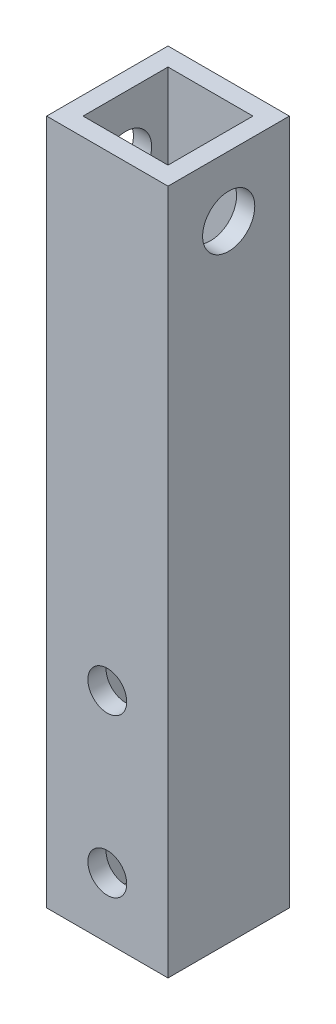
ISO-10303-21;
HEADER;
FILE_DESCRIPTION(('STEP AP214'),'2;1');
FILE_NAME('part.step','',(''),(''),'','','');
FILE_SCHEMA(('AUTOMOTIVE_DESIGN { 1 0 10303 214 1 1 1 1 }'));
ENDSEC;
DATA;
#1=APPLICATION_CONTEXT('core data for automotive mechanical design processes');
#2=APPLICATION_PROTOCOL_DEFINITION('international standard','automotive_design',2000,#1);
#3=PRODUCT_CONTEXT('',#1,'mechanical');
#4=PRODUCT('Part','Part','',(#3));
#5=PRODUCT_RELATED_PRODUCT_CATEGORY('part','',(#4));
#6=PRODUCT_DEFINITION_FORMATION('','',#4);
#7=PRODUCT_DEFINITION_CONTEXT('part definition',#1,'design');
#8=PRODUCT_DEFINITION('design','',#6,#7);
#9=PRODUCT_DEFINITION_SHAPE('','',#8);
#10=(LENGTH_UNIT() NAMED_UNIT(*) SI_UNIT(.MILLI.,.METRE.));
#11=(NAMED_UNIT(*) PLANE_ANGLE_UNIT() SI_UNIT($,.RADIAN.));
#12=(NAMED_UNIT(*) SI_UNIT($,.STERADIAN.) SOLID_ANGLE_UNIT());
#13=UNCERTAINTY_MEASURE_WITH_UNIT(LENGTH_MEASURE(1.E-05),#10,'distance_accuracy_value','');
#14=(GEOMETRIC_REPRESENTATION_CONTEXT(3) GLOBAL_UNCERTAINTY_ASSIGNED_CONTEXT((#13)) GLOBAL_UNIT_ASSIGNED_CONTEXT((#10,
#11,#12)) REPRESENTATION_CONTEXT('',''));
#15=CARTESIAN_POINT('',(0.,0.,0.));
#16=DIRECTION('',(0.,0.,1.));
#17=DIRECTION('',(1.,0.,0.));
#18=AXIS2_PLACEMENT_3D('',#15,#16,#17);
#19=CARTESIAN_POINT('',(0.,56.5,0.));
#20=DIRECTION('',(0.,1.,0.));
#21=DIRECTION('',(0.,0.,1.));
#22=AXIS2_PLACEMENT_3D('',#19,#20,#21);
#23=PLANE('',#22);
#24=DIRECTION('',(0.,0.,-1.));
#25=VECTOR('',#24,1.);
#26=CARTESIAN_POINT('',(5.,56.5,-5.));
#27=LINE('',#26,#25);
#28=CARTESIAN_POINT('',(5.,56.5,5.));
#29=VERTEX_POINT('',#28);
#30=CARTESIAN_POINT('',(5.,56.5,-5.));
#31=VERTEX_POINT('',#30);
#32=EDGE_CURVE('E162',#29,#31,#27,.T.);
#33=ORIENTED_EDGE('',*,*,#32,.T.);
#34=DIRECTION('',(-1.,0.,0.));
#35=VECTOR('',#34,1.);
#36=CARTESIAN_POINT('',(-5.,56.5,-5.));
#37=LINE('',#36,#35);
#38=CARTESIAN_POINT('',(-5.,56.5,-5.));
#39=VERTEX_POINT('',#38);
#40=EDGE_CURVE('E165',#31,#39,#37,.T.);
#41=ORIENTED_EDGE('',*,*,#40,.T.);
#42=DIRECTION('',(0.,0.,1.));
#43=VECTOR('',#42,1.);
#44=CARTESIAN_POINT('',(-5.,56.5,-5.));
#45=LINE('',#44,#43);
#46=CARTESIAN_POINT('',(-5.,56.5,5.));
#47=VERTEX_POINT('',#46);
#48=EDGE_CURVE('E168',#39,#47,#45,.T.);
#49=ORIENTED_EDGE('',*,*,#48,.T.);
#50=DIRECTION('',(1.,0.,0.));
#51=VECTOR('',#50,1.);
#52=CARTESIAN_POINT('',(-5.,56.5,5.));
#53=LINE('',#52,#51);
#54=EDGE_CURVE('E170',#47,#29,#53,.T.);
#55=ORIENTED_EDGE('',*,*,#54,.T.);
#56=EDGE_LOOP('',(#33,#41,#49,#55));
#57=FACE_BOUND('',#56,.T.);
#58=DIRECTION('',(-1.,0.,0.));
#59=VECTOR('',#58,1.);
#60=CARTESIAN_POINT('',(-5.,56.5,-3.5));
#61=LINE('',#60,#59);
#62=CARTESIAN_POINT('',(3.5,56.5,-3.5));
#63=VERTEX_POINT('',#62);
#64=CARTESIAN_POINT('',(-3.5,56.5,-3.5));
#65=VERTEX_POINT('',#64);
#66=EDGE_CURVE('E132',#63,#65,#61,.T.);
#67=ORIENTED_EDGE('',*,*,#66,.F.);
#68=DIRECTION('',(0.,0.,-1.));
#69=VECTOR('',#68,1.);
#70=CARTESIAN_POINT('',(3.5,56.5,-5.));
#71=LINE('',#70,#69);
#72=CARTESIAN_POINT('',(3.5,56.5,3.5));
#73=VERTEX_POINT('',#72);
#74=EDGE_CURVE('E124',#73,#63,#71,.T.);
#75=ORIENTED_EDGE('',*,*,#74,.F.);
#76=DIRECTION('',(1.,0.,0.));
#77=VECTOR('',#76,1.);
#78=CARTESIAN_POINT('',(-5.,56.5,3.5));
#79=LINE('',#78,#77);
#80=CARTESIAN_POINT('',(-3.5,56.5,3.5));
#81=VERTEX_POINT('',#80);
#82=EDGE_CURVE('E146',#81,#73,#79,.T.);
#83=ORIENTED_EDGE('',*,*,#82,.F.);
#84=DIRECTION('',(0.,0.,1.));
#85=VECTOR('',#84,1.);
#86=CARTESIAN_POINT('',(-3.5,56.5,-5.));
#87=LINE('',#86,#85);
#88=EDGE_CURVE('E144',#65,#81,#87,.T.);
#89=ORIENTED_EDGE('',*,*,#88,.F.);
#90=EDGE_LOOP('',(#67,#75,#83,#89));
#91=FACE_BOUND('',#90,.T.);
#92=ADVANCED_FACE('F57',(#57,#91),#23,.T.);
#93=CARTESIAN_POINT('',(0.,0.,0.));
#94=DIRECTION('',(0.,1.,0.));
#95=DIRECTION('',(0.,0.,1.));
#96=AXIS2_PLACEMENT_3D('',#93,#94,#95);
#97=PLANE('',#96);
#98=DIRECTION('',(0.,0.,-1.));
#99=VECTOR('',#98,1.);
#100=CARTESIAN_POINT('',(5.,0.,-5.));
#101=LINE('',#100,#99);
#102=CARTESIAN_POINT('',(5.,0.,5.));
#103=VERTEX_POINT('',#102);
#104=CARTESIAN_POINT('',(5.,0.,-5.));
#105=VERTEX_POINT('',#104);
#106=EDGE_CURVE('E140',#103,#105,#101,.T.);
#107=ORIENTED_EDGE('',*,*,#106,.F.);
#108=DIRECTION('',(1.,0.,0.));
#109=VECTOR('',#108,1.);
#110=CARTESIAN_POINT('',(-5.,0.,5.));
#111=LINE('',#110,#109);
#112=CARTESIAN_POINT('',(-5.,0.,5.));
#113=VERTEX_POINT('',#112);
#114=EDGE_CURVE('E166',#113,#103,#111,.T.);
#115=ORIENTED_EDGE('',*,*,#114,.F.);
#116=DIRECTION('',(0.,0.,1.));
#117=VECTOR('',#116,1.);
#118=CARTESIAN_POINT('',(-5.,0.,-5.));
#119=LINE('',#118,#117);
#120=CARTESIAN_POINT('',(-5.,0.,-5.));
#121=VERTEX_POINT('',#120);
#122=EDGE_CURVE('E177',#121,#113,#119,.T.);
#123=ORIENTED_EDGE('',*,*,#122,.F.);
#124=DIRECTION('',(-1.,0.,0.));
#125=VECTOR('',#124,1.);
#126=CARTESIAN_POINT('',(-5.,0.,-5.));
#127=LINE('',#126,#125);
#128=EDGE_CURVE('E175',#105,#121,#127,.T.);
#129=ORIENTED_EDGE('',*,*,#128,.F.);
#130=EDGE_LOOP('',(#107,#115,#123,#129));
#131=FACE_BOUND('',#130,.T.);
#132=DIRECTION('',(0.,0.,-1.));
#133=VECTOR('',#132,1.);
#134=CARTESIAN_POINT('',(3.5,0.,-5.));
#135=LINE('',#134,#133);
#136=CARTESIAN_POINT('',(3.5,0.,3.5));
#137=VERTEX_POINT('',#136);
#138=CARTESIAN_POINT('',(3.5,0.,-3.5));
#139=VERTEX_POINT('',#138);
#140=EDGE_CURVE('E82',#137,#139,#135,.T.);
#141=ORIENTED_EDGE('',*,*,#140,.T.);
#142=DIRECTION('',(-1.,0.,0.));
#143=VECTOR('',#142,1.);
#144=CARTESIAN_POINT('',(-5.,0.,-3.5));
#145=LINE('',#144,#143);
#146=CARTESIAN_POINT('',(-3.5,0.,-3.5));
#147=VERTEX_POINT('',#146);
#148=EDGE_CURVE('E139',#139,#147,#145,.T.);
#149=ORIENTED_EDGE('',*,*,#148,.T.);
#150=DIRECTION('',(0.,0.,1.));
#151=VECTOR('',#150,1.);
#152=CARTESIAN_POINT('',(-3.5,0.,-5.));
#153=LINE('',#152,#151);
#154=CARTESIAN_POINT('',(-3.5,0.,3.5));
#155=VERTEX_POINT('',#154);
#156=EDGE_CURVE('E154',#147,#155,#153,.T.);
#157=ORIENTED_EDGE('',*,*,#156,.T.);
#158=DIRECTION('',(1.,0.,0.));
#159=VECTOR('',#158,1.);
#160=CARTESIAN_POINT('',(-5.,0.,3.5));
#161=LINE('',#160,#159);
#162=EDGE_CURVE('E133',#155,#137,#161,.T.);
#163=ORIENTED_EDGE('',*,*,#162,.T.);
#164=EDGE_LOOP('',(#141,#149,#157,#163));
#165=FACE_BOUND('',#164,.T.);
#166=ADVANCED_FACE('F235',(#131,#165),#97,.F.);
#167=CARTESIAN_POINT('',(5.,56.5,-5.));
#168=DIRECTION('',(-1.,0.,0.));
#169=DIRECTION('',(0.,0.,1.));
#170=AXIS2_PLACEMENT_3D('',#167,#168,#169);
#171=PLANE('',#170);
#172=CARTESIAN_POINT('',(5.,51.5,0.));
#173=DIRECTION('',(1.,0.,0.));
#174=DIRECTION('',(0.,0.,-1.));
#175=AXIS2_PLACEMENT_3D('',#172,#173,#174);
#176=CIRCLE('',#175,2.15);
#177=CARTESIAN_POINT('',(5.,51.5,-2.15));
#178=VERTEX_POINT('',#177);
#179=EDGE_CURVE('E215',#178,#178,#176,.T.);
#180=ORIENTED_EDGE('',*,*,#179,.F.);
#181=EDGE_LOOP('',(#180));
#182=FACE_BOUND('',#181,.T.);
#183=ORIENTED_EDGE('',*,*,#106,.T.);
#184=DIRECTION('',(0.,-1.,0.));
#185=VECTOR('',#184,1.);
#186=CARTESIAN_POINT('',(5.,56.5,-5.));
#187=LINE('',#186,#185);
#188=EDGE_CURVE('E12',#31,#105,#187,.T.);
#189=ORIENTED_EDGE('',*,*,#188,.F.);
#190=ORIENTED_EDGE('',*,*,#32,.F.);
#191=DIRECTION('',(0.,-1.,0.));
#192=VECTOR('',#191,1.);
#193=CARTESIAN_POINT('',(5.,56.5,5.));
#194=LINE('',#193,#192);
#195=EDGE_CURVE('E172',#29,#103,#194,.T.);
#196=ORIENTED_EDGE('',*,*,#195,.T.);
#197=EDGE_LOOP('',(#183,#189,#190,#196));
#198=FACE_BOUND('',#197,.T.);
#199=ADVANCED_FACE('F59',(#182,#198),#171,.F.);
#200=CARTESIAN_POINT('',(-5.,56.5,-5.));
#201=DIRECTION('',(0.,0.,1.));
#202=DIRECTION('',(1.,0.,0.));
#203=AXIS2_PLACEMENT_3D('',#200,#201,#202);
#204=PLANE('',#203);
#205=CARTESIAN_POINT('',(0.,18.,-5.));
#206=DIRECTION('',(0.,0.,1.));
#207=DIRECTION('',(1.,0.,0.));
#208=AXIS2_PLACEMENT_3D('',#205,#206,#207);
#209=CIRCLE('',#208,1.6);
#210=CARTESIAN_POINT('',(1.6,18.,-5.));
#211=VERTEX_POINT('',#210);
#212=EDGE_CURVE('E190',#211,#211,#209,.T.);
#213=ORIENTED_EDGE('',*,*,#212,.T.);
#214=EDGE_LOOP('',(#213));
#215=FACE_BOUND('',#214,.T.);
#216=CARTESIAN_POINT('',(0.,5.,-5.));
#217=DIRECTION('',(0.,0.,1.));
#218=DIRECTION('',(1.,0.,0.));
#219=AXIS2_PLACEMENT_3D('',#216,#217,#218);
#220=CIRCLE('',#219,1.6);
#221=CARTESIAN_POINT('',(1.6,5.,-5.));
#222=VERTEX_POINT('',#221);
#223=EDGE_CURVE('E204',#222,#222,#220,.T.);
#224=ORIENTED_EDGE('',*,*,#223,.T.);
#225=EDGE_LOOP('',(#224));
#226=FACE_BOUND('',#225,.T.);
#227=ORIENTED_EDGE('',*,*,#128,.T.);
#228=DIRECTION('',(0.,-1.,0.));
#229=VECTOR('',#228,1.);
#230=CARTESIAN_POINT('',(-5.,56.5,-5.));
#231=LINE('',#230,#229);
#232=EDGE_CURVE('E66',#39,#121,#231,.T.);
#233=ORIENTED_EDGE('',*,*,#232,.F.);
#234=ORIENTED_EDGE('',*,*,#40,.F.);
#235=ORIENTED_EDGE('',*,*,#188,.T.);
#236=EDGE_LOOP('',(#227,#233,#234,#235));
#237=FACE_BOUND('',#236,.T.);
#238=ADVANCED_FACE('F265',(#215,#226,#237),#204,.F.);
#239=CARTESIAN_POINT('',(-5.,56.5,-5.));
#240=DIRECTION('',(1.,0.,0.));
#241=DIRECTION('',(0.,0.,-1.));
#242=AXIS2_PLACEMENT_3D('',#239,#240,#241);
#243=PLANE('',#242);
#244=CARTESIAN_POINT('',(-5.,51.5,0.));
#245=DIRECTION('',(1.,0.,0.));
#246=DIRECTION('',(0.,0.,-1.));
#247=AXIS2_PLACEMENT_3D('',#244,#245,#246);
#248=CIRCLE('',#247,2.15);
#249=CARTESIAN_POINT('',(-5.,51.5,-2.15));
#250=VERTEX_POINT('',#249);
#251=EDGE_CURVE('E218',#250,#250,#248,.T.);
#252=ORIENTED_EDGE('',*,*,#251,.T.);
#253=EDGE_LOOP('',(#252));
#254=FACE_BOUND('',#253,.T.);
#255=ORIENTED_EDGE('',*,*,#122,.T.);
#256=DIRECTION('',(0.,-1.,0.));
#257=VECTOR('',#256,1.);
#258=CARTESIAN_POINT('',(-5.,56.5,5.));
#259=LINE('',#258,#257);
#260=EDGE_CURVE('E182',#47,#113,#259,.T.);
#261=ORIENTED_EDGE('',*,*,#260,.F.);
#262=ORIENTED_EDGE('',*,*,#48,.F.);
#263=ORIENTED_EDGE('',*,*,#232,.T.);
#264=EDGE_LOOP('',(#255,#261,#262,#263));
#265=FACE_BOUND('',#264,.T.);
#266=ADVANCED_FACE('F262',(#254,#265),#243,.F.);
#267=CARTESIAN_POINT('',(-5.,56.5,5.));
#268=DIRECTION('',(0.,0.,-1.));
#269=DIRECTION('',(-1.,0.,0.));
#270=AXIS2_PLACEMENT_3D('',#267,#268,#269);
#271=PLANE('',#270);
#272=CARTESIAN_POINT('',(0.,18.,5.));
#273=DIRECTION('',(0.,0.,1.));
#274=DIRECTION('',(1.,0.,0.));
#275=AXIS2_PLACEMENT_3D('',#272,#273,#274);
#276=CIRCLE('',#275,1.6);
#277=CARTESIAN_POINT('',(1.6,18.,5.));
#278=VERTEX_POINT('',#277);
#279=EDGE_CURVE('E208',#278,#278,#276,.T.);
#280=ORIENTED_EDGE('',*,*,#279,.F.);
#281=EDGE_LOOP('',(#280));
#282=FACE_BOUND('',#281,.T.);
#283=CARTESIAN_POINT('',(0.,5.,5.));
#284=DIRECTION('',(0.,0.,1.));
#285=DIRECTION('',(1.,0.,0.));
#286=AXIS2_PLACEMENT_3D('',#283,#284,#285);
#287=CIRCLE('',#286,1.6);
#288=CARTESIAN_POINT('',(1.6,5.,5.));
#289=VERTEX_POINT('',#288);
#290=EDGE_CURVE('E201',#289,#289,#287,.T.);
#291=ORIENTED_EDGE('',*,*,#290,.F.);
#292=EDGE_LOOP('',(#291));
#293=FACE_BOUND('',#292,.T.);
#294=ORIENTED_EDGE('',*,*,#114,.T.);
#295=ORIENTED_EDGE('',*,*,#195,.F.);
#296=ORIENTED_EDGE('',*,*,#54,.F.);
#297=ORIENTED_EDGE('',*,*,#260,.T.);
#298=EDGE_LOOP('',(#294,#295,#296,#297));
#299=FACE_BOUND('',#298,.T.);
#300=ADVANCED_FACE('F259',(#282,#293,#299),#271,.F.);
#301=CARTESIAN_POINT('',(3.5,56.5,-5.));
#302=DIRECTION('',(-1.,0.,0.));
#303=DIRECTION('',(0.,0.,1.));
#304=AXIS2_PLACEMENT_3D('',#301,#302,#303);
#305=PLANE('',#304);
#306=CARTESIAN_POINT('',(3.5,51.5,0.));
#307=DIRECTION('',(-1.,0.,0.));
#308=DIRECTION('',(0.,0.,1.));
#309=AXIS2_PLACEMENT_3D('',#306,#307,#308);
#310=CIRCLE('',#309,2.15);
#311=CARTESIAN_POINT('',(3.5,51.5,2.15));
#312=VERTEX_POINT('',#311);
#313=EDGE_CURVE('E205',#312,#312,#310,.T.);
#314=ORIENTED_EDGE('',*,*,#313,.F.);
#315=EDGE_LOOP('',(#314));
#316=FACE_BOUND('',#315,.T.);
#317=ORIENTED_EDGE('',*,*,#140,.F.);
#318=DIRECTION('',(0.,-1.,0.));
#319=VECTOR('',#318,1.);
#320=CARTESIAN_POINT('',(3.5,56.5,3.5));
#321=LINE('',#320,#319);
#322=EDGE_CURVE('E128',#73,#137,#321,.T.);
#323=ORIENTED_EDGE('',*,*,#322,.F.);
#324=ORIENTED_EDGE('',*,*,#74,.T.);
#325=DIRECTION('',(0.,-1.,0.));
#326=VECTOR('',#325,1.);
#327=CARTESIAN_POINT('',(3.5,56.5,-3.5));
#328=LINE('',#327,#326);
#329=EDGE_CURVE('E127',#63,#139,#328,.T.);
#330=ORIENTED_EDGE('',*,*,#329,.T.);
#331=EDGE_LOOP('',(#317,#323,#324,#330));
#332=FACE_BOUND('',#331,.T.);
#333=ADVANCED_FACE('F126',(#316,#332),#305,.T.);
#334=CARTESIAN_POINT('',(-5.,56.5,-3.5));
#335=DIRECTION('',(0.,0.,1.));
#336=DIRECTION('',(1.,0.,0.));
#337=AXIS2_PLACEMENT_3D('',#334,#335,#336);
#338=PLANE('',#337);
#339=CARTESIAN_POINT('',(0.,18.,-3.5));
#340=DIRECTION('',(0.,0.,1.));
#341=DIRECTION('',(1.,0.,0.));
#342=AXIS2_PLACEMENT_3D('',#339,#340,#341);
#343=CIRCLE('',#342,1.6);
#344=CARTESIAN_POINT('',(1.6,18.,-3.5));
#345=VERTEX_POINT('',#344);
#346=EDGE_CURVE('E152',#345,#345,#343,.T.);
#347=ORIENTED_EDGE('',*,*,#346,.F.);
#348=EDGE_LOOP('',(#347));
#349=FACE_BOUND('',#348,.T.);
#350=CARTESIAN_POINT('',(0.,5.,-3.5));
#351=DIRECTION('',(0.,0.,1.));
#352=DIRECTION('',(1.,0.,0.));
#353=AXIS2_PLACEMENT_3D('',#350,#351,#352);
#354=CIRCLE('',#353,1.6);
#355=CARTESIAN_POINT('',(1.6,5.,-3.5));
#356=VERTEX_POINT('',#355);
#357=EDGE_CURVE('E189',#356,#356,#354,.T.);
#358=ORIENTED_EDGE('',*,*,#357,.F.);
#359=EDGE_LOOP('',(#358));
#360=FACE_BOUND('',#359,.T.);
#361=ORIENTED_EDGE('',*,*,#148,.F.);
#362=ORIENTED_EDGE('',*,*,#329,.F.);
#363=ORIENTED_EDGE('',*,*,#66,.T.);
#364=DIRECTION('',(0.,-1.,0.));
#365=VECTOR('',#364,1.);
#366=CARTESIAN_POINT('',(-3.5,56.5,-3.5));
#367=LINE('',#366,#365);
#368=EDGE_CURVE('E141',#65,#147,#367,.T.);
#369=ORIENTED_EDGE('',*,*,#368,.T.);
#370=EDGE_LOOP('',(#361,#362,#363,#369));
#371=FACE_BOUND('',#370,.T.);
#372=ADVANCED_FACE('F136',(#349,#360,#371),#338,.T.);
#373=CARTESIAN_POINT('',(-3.5,56.5,-5.));
#374=DIRECTION('',(1.,0.,0.));
#375=DIRECTION('',(0.,0.,-1.));
#376=AXIS2_PLACEMENT_3D('',#373,#374,#375);
#377=PLANE('',#376);
#378=CARTESIAN_POINT('',(-3.5,51.5,0.));
#379=DIRECTION('',(1.,0.,0.));
#380=DIRECTION('',(0.,0.,-1.));
#381=AXIS2_PLACEMENT_3D('',#378,#379,#380);
#382=CIRCLE('',#381,2.15);
#383=CARTESIAN_POINT('',(-3.5,51.5,-2.15));
#384=VERTEX_POINT('',#383);
#385=EDGE_CURVE('E61',#384,#384,#382,.T.);
#386=ORIENTED_EDGE('',*,*,#385,.F.);
#387=EDGE_LOOP('',(#386));
#388=FACE_BOUND('',#387,.T.);
#389=ORIENTED_EDGE('',*,*,#156,.F.);
#390=ORIENTED_EDGE('',*,*,#368,.F.);
#391=ORIENTED_EDGE('',*,*,#88,.T.);
#392=DIRECTION('',(0.,-1.,0.));
#393=VECTOR('',#392,1.);
#394=CARTESIAN_POINT('',(-3.5,56.5,3.5));
#395=LINE('',#394,#393);
#396=EDGE_CURVE('E74',#81,#155,#395,.T.);
#397=ORIENTED_EDGE('',*,*,#396,.T.);
#398=EDGE_LOOP('',(#389,#390,#391,#397));
#399=FACE_BOUND('',#398,.T.);
#400=ADVANCED_FACE('F228',(#388,#399),#377,.T.);
#401=CARTESIAN_POINT('',(-5.,56.5,3.5));
#402=DIRECTION('',(0.,0.,-1.));
#403=DIRECTION('',(-1.,0.,0.));
#404=AXIS2_PLACEMENT_3D('',#401,#402,#403);
#405=PLANE('',#404);
#406=CARTESIAN_POINT('',(0.,18.,3.5));
#407=DIRECTION('',(0.,0.,-1.));
#408=DIRECTION('',(-1.,0.,0.));
#409=AXIS2_PLACEMENT_3D('',#406,#407,#408);
#410=CIRCLE('',#409,1.6);
#411=CARTESIAN_POINT('',(-1.6,18.,3.5));
#412=VERTEX_POINT('',#411);
#413=EDGE_CURVE('E191',#412,#412,#410,.T.);
#414=ORIENTED_EDGE('',*,*,#413,.F.);
#415=EDGE_LOOP('',(#414));
#416=FACE_BOUND('',#415,.T.);
#417=CARTESIAN_POINT('',(0.,5.,3.5));
#418=DIRECTION('',(0.,0.,-1.));
#419=DIRECTION('',(-1.,0.,0.));
#420=AXIS2_PLACEMENT_3D('',#417,#418,#419);
#421=CIRCLE('',#420,1.6);
#422=CARTESIAN_POINT('',(-1.6,5.,3.5));
#423=VERTEX_POINT('',#422);
#424=EDGE_CURVE('E187',#423,#423,#421,.T.);
#425=ORIENTED_EDGE('',*,*,#424,.F.);
#426=EDGE_LOOP('',(#425));
#427=FACE_BOUND('',#426,.T.);
#428=ORIENTED_EDGE('',*,*,#162,.F.);
#429=ORIENTED_EDGE('',*,*,#396,.F.);
#430=ORIENTED_EDGE('',*,*,#82,.T.);
#431=ORIENTED_EDGE('',*,*,#322,.T.);
#432=EDGE_LOOP('',(#428,#429,#430,#431));
#433=FACE_BOUND('',#432,.T.);
#434=ADVANCED_FACE('F231',(#416,#427,#433),#405,.T.);
#435=CARTESIAN_POINT('',(0.,5.,-5.));
#436=DIRECTION('',(0.,0.,1.));
#437=DIRECTION('',(1.,0.,0.));
#438=AXIS2_PLACEMENT_3D('',#435,#436,#437);
#439=CYLINDRICAL_SURFACE('',#438,1.6);
#440=ORIENTED_EDGE('',*,*,#424,.T.);
#441=EDGE_LOOP('',(#440));
#442=FACE_BOUND('',#441,.T.);
#443=ORIENTED_EDGE('',*,*,#290,.T.);
#444=EDGE_LOOP('',(#443));
#445=FACE_BOUND('',#444,.T.);
#446=ADVANCED_FACE('F237',(#442,#445),#439,.F.);
#447=CARTESIAN_POINT('',(0.,18.,-5.));
#448=DIRECTION('',(0.,0.,1.));
#449=DIRECTION('',(1.,0.,0.));
#450=AXIS2_PLACEMENT_3D('',#447,#448,#449);
#451=CYLINDRICAL_SURFACE('',#450,1.6);
#452=ORIENTED_EDGE('',*,*,#413,.T.);
#453=EDGE_LOOP('',(#452));
#454=FACE_BOUND('',#453,.T.);
#455=ORIENTED_EDGE('',*,*,#279,.T.);
#456=EDGE_LOOP('',(#455));
#457=FACE_BOUND('',#456,.T.);
#458=ADVANCED_FACE('F243',(#454,#457),#451,.F.);
#459=ORIENTED_EDGE('',*,*,#357,.T.);
#460=EDGE_LOOP('',(#459));
#461=FACE_BOUND('',#460,.T.);
#462=ORIENTED_EDGE('',*,*,#223,.F.);
#463=EDGE_LOOP('',(#462));
#464=FACE_BOUND('',#463,.T.);
#465=ADVANCED_FACE('F246',(#461,#464),#439,.F.);
#466=ORIENTED_EDGE('',*,*,#346,.T.);
#467=EDGE_LOOP('',(#466));
#468=FACE_BOUND('',#467,.T.);
#469=ORIENTED_EDGE('',*,*,#212,.F.);
#470=EDGE_LOOP('',(#469));
#471=FACE_BOUND('',#470,.T.);
#472=ADVANCED_FACE('F291',(#468,#471),#451,.F.);
#473=CARTESIAN_POINT('',(-5.,51.5,0.));
#474=DIRECTION('',(1.,0.,0.));
#475=DIRECTION('',(0.,0.,-1.));
#476=AXIS2_PLACEMENT_3D('',#473,#474,#475);
#477=CYLINDRICAL_SURFACE('',#476,2.15);
#478=ORIENTED_EDGE('',*,*,#385,.T.);
#479=EDGE_LOOP('',(#478));
#480=FACE_BOUND('',#479,.T.);
#481=ORIENTED_EDGE('',*,*,#251,.F.);
#482=EDGE_LOOP('',(#481));
#483=FACE_BOUND('',#482,.T.);
#484=ADVANCED_FACE('F225',(#480,#483),#477,.F.);
#485=ORIENTED_EDGE('',*,*,#313,.T.);
#486=EDGE_LOOP('',(#485));
#487=FACE_BOUND('',#486,.T.);
#488=ORIENTED_EDGE('',*,*,#179,.T.);
#489=EDGE_LOOP('',(#488));
#490=FACE_BOUND('',#489,.T.);
#491=ADVANCED_FACE('F300',(#487,#490),#477,.F.);
#492=CLOSED_SHELL('',(#92,#166,#199,#238,#266,#300,#333,#372,#400,#434,#446,#458,#465,#472,#484,#491));
#493=MANIFOLD_SOLID_BREP('B2',#492);
#494=ADVANCED_BREP_SHAPE_REPRESENTATION('',(#18,#493),#14);
#495=SHAPE_DEFINITION_REPRESENTATION(#9,#494);
ENDSEC;
END-ISO-10303-21;
